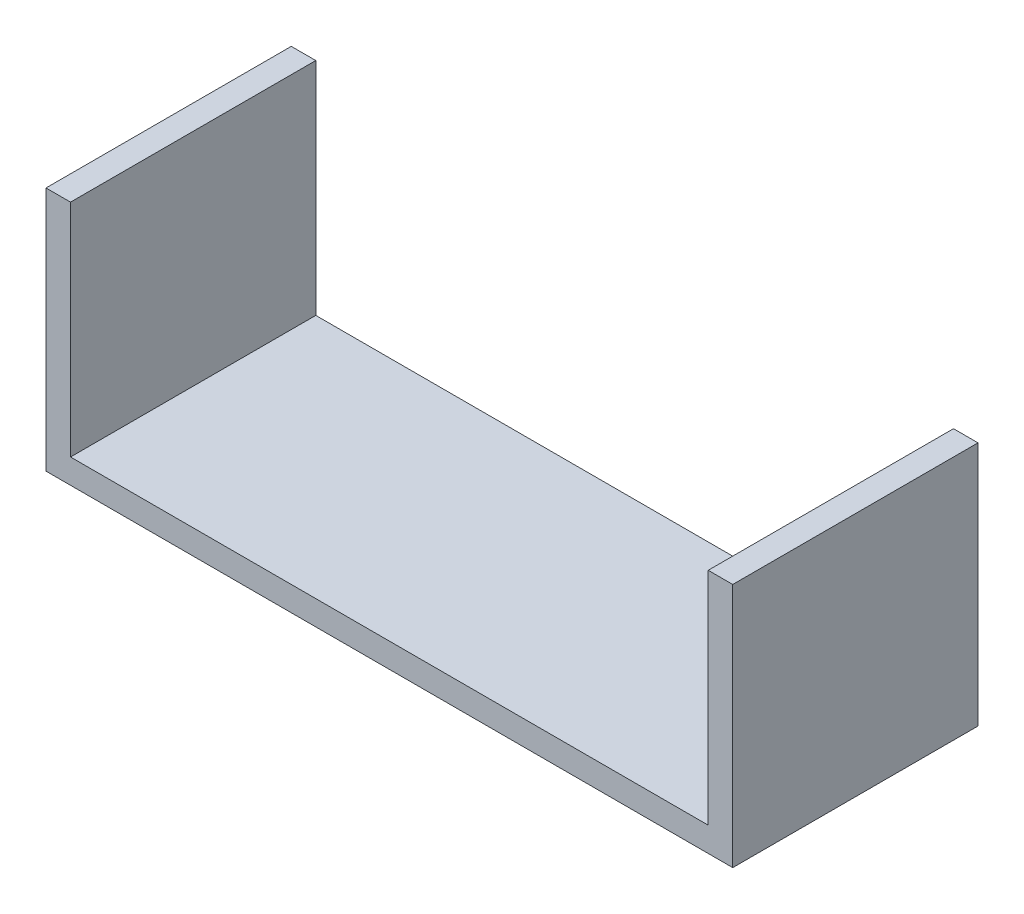
ISO-10303-21;
HEADER;
FILE_DESCRIPTION(('STEP AP214'),'2;1');
FILE_NAME('part.step','',(''),(''),'','','');
FILE_SCHEMA(('AUTOMOTIVE_DESIGN { 1 0 10303 214 1 1 1 1 }'));
ENDSEC;
DATA;
#1=APPLICATION_CONTEXT('core data for automotive mechanical design processes');
#2=APPLICATION_PROTOCOL_DEFINITION('international standard','automotive_design',2000,#1);
#3=PRODUCT_CONTEXT('',#1,'mechanical');
#4=PRODUCT('Part','Part','',(#3));
#5=PRODUCT_RELATED_PRODUCT_CATEGORY('part','',(#4));
#6=PRODUCT_DEFINITION_FORMATION('','',#4);
#7=PRODUCT_DEFINITION_CONTEXT('part definition',#1,'design');
#8=PRODUCT_DEFINITION('design','',#6,#7);
#9=PRODUCT_DEFINITION_SHAPE('','',#8);
#10=(LENGTH_UNIT() NAMED_UNIT(*) SI_UNIT(.MILLI.,.METRE.));
#11=(NAMED_UNIT(*) PLANE_ANGLE_UNIT() SI_UNIT($,.RADIAN.));
#12=(NAMED_UNIT(*) SI_UNIT($,.STERADIAN.) SOLID_ANGLE_UNIT());
#13=UNCERTAINTY_MEASURE_WITH_UNIT(LENGTH_MEASURE(1.E-05),#10,'distance_accuracy_value','');
#14=(GEOMETRIC_REPRESENTATION_CONTEXT(3) GLOBAL_UNCERTAINTY_ASSIGNED_CONTEXT((#13)) GLOBAL_UNIT_ASSIGNED_CONTEXT((#10,
#11,#12)) REPRESENTATION_CONTEXT('',''));
#15=CARTESIAN_POINT('',(0.,0.,0.));
#16=DIRECTION('',(0.,0.,1.));
#17=DIRECTION('',(1.,0.,0.));
#18=AXIS2_PLACEMENT_3D('',#15,#16,#17);
#19=CARTESIAN_POINT('',(0.,50.,50.));
#20=DIRECTION('',(0.,1.,0.));
#21=DIRECTION('',(0.,0.,1.));
#22=AXIS2_PLACEMENT_3D('',#19,#20,#21);
#23=PLANE('',#22);
#24=DIRECTION('',(1.,0.,0.));
#25=VECTOR('',#24,1.);
#26=CARTESIAN_POINT('',(0.,50.,0.));
#27=LINE('',#26,#25);
#28=CARTESIAN_POINT('',(135.,50.,0.));
#29=VERTEX_POINT('',#28);
#30=CARTESIAN_POINT('',(140.,50.,0.));
#31=VERTEX_POINT('',#30);
#32=EDGE_CURVE('E145',#29,#31,#27,.T.);
#33=ORIENTED_EDGE('',*,*,#32,.F.);
#34=DIRECTION('',(0.,0.,-1.));
#35=VECTOR('',#34,1.);
#36=CARTESIAN_POINT('',(135.,50.,50.));
#37=LINE('',#36,#35);
#38=CARTESIAN_POINT('',(135.,50.,50.));
#39=VERTEX_POINT('',#38);
#40=EDGE_CURVE('E11',#39,#29,#37,.T.);
#41=ORIENTED_EDGE('',*,*,#40,.F.);
#42=DIRECTION('',(1.,0.,0.));
#43=VECTOR('',#42,1.);
#44=CARTESIAN_POINT('',(0.,50.,50.));
#45=LINE('',#44,#43);
#46=CARTESIAN_POINT('',(140.,50.,50.));
#47=VERTEX_POINT('',#46);
#48=EDGE_CURVE('E139',#39,#47,#45,.T.);
#49=ORIENTED_EDGE('',*,*,#48,.T.);
#50=DIRECTION('',(0.,0.,-1.));
#51=VECTOR('',#50,1.);
#52=CARTESIAN_POINT('',(140.,50.,50.));
#53=LINE('',#52,#51);
#54=EDGE_CURVE('E93',#47,#31,#53,.T.);
#55=ORIENTED_EDGE('',*,*,#54,.T.);
#56=EDGE_LOOP('',(#33,#41,#49,#55));
#57=FACE_BOUND('',#56,.T.);
#58=ADVANCED_FACE('F41',(#57),#23,.T.);
#59=CARTESIAN_POINT('',(135.,0.,50.));
#60=DIRECTION('',(1.,0.,0.));
#61=DIRECTION('',(0.,0.,-1.));
#62=AXIS2_PLACEMENT_3D('',#59,#60,#61);
#63=PLANE('',#62);
#64=DIRECTION('',(0.,-1.,0.));
#65=VECTOR('',#64,1.);
#66=CARTESIAN_POINT('',(135.,0.,0.));
#67=LINE('',#66,#65);
#68=CARTESIAN_POINT('',(135.,5.,0.));
#69=VERTEX_POINT('',#68);
#70=EDGE_CURVE('E149',#29,#69,#67,.T.);
#71=ORIENTED_EDGE('',*,*,#70,.T.);
#72=DIRECTION('',(0.,0.,-1.));
#73=VECTOR('',#72,1.);
#74=CARTESIAN_POINT('',(135.,5.,50.));
#75=LINE('',#74,#73);
#76=CARTESIAN_POINT('',(135.,5.,50.));
#77=VERTEX_POINT('',#76);
#78=EDGE_CURVE('E51',#77,#69,#75,.T.);
#79=ORIENTED_EDGE('',*,*,#78,.F.);
#80=DIRECTION('',(0.,-1.,0.));
#81=VECTOR('',#80,1.);
#82=CARTESIAN_POINT('',(135.,0.,50.));
#83=LINE('',#82,#81);
#84=EDGE_CURVE('E198',#39,#77,#83,.T.);
#85=ORIENTED_EDGE('',*,*,#84,.F.);
#86=ORIENTED_EDGE('',*,*,#40,.T.);
#87=EDGE_LOOP('',(#71,#79,#85,#86));
#88=FACE_BOUND('',#87,.T.);
#89=ADVANCED_FACE('F43',(#88),#63,.F.);
#90=CARTESIAN_POINT('',(0.,5.,50.));
#91=DIRECTION('',(0.,1.,0.));
#92=DIRECTION('',(0.,0.,1.));
#93=AXIS2_PLACEMENT_3D('',#90,#91,#92);
#94=PLANE('',#93);
#95=DIRECTION('',(1.,0.,0.));
#96=VECTOR('',#95,1.);
#97=CARTESIAN_POINT('',(0.,5.,0.));
#98=LINE('',#97,#96);
#99=CARTESIAN_POINT('',(5.,5.,0.));
#100=VERTEX_POINT('',#99);
#101=EDGE_CURVE('E154',#100,#69,#98,.T.);
#102=ORIENTED_EDGE('',*,*,#101,.F.);
#103=DIRECTION('',(0.,0.,-1.));
#104=VECTOR('',#103,1.);
#105=CARTESIAN_POINT('',(5.,5.,50.));
#106=LINE('',#105,#104);
#107=CARTESIAN_POINT('',(5.,5.,50.));
#108=VERTEX_POINT('',#107);
#109=EDGE_CURVE('E178',#108,#100,#106,.T.);
#110=ORIENTED_EDGE('',*,*,#109,.F.);
#111=DIRECTION('',(1.,0.,0.));
#112=VECTOR('',#111,1.);
#113=CARTESIAN_POINT('',(0.,5.,50.));
#114=LINE('',#113,#112);
#115=EDGE_CURVE('E187',#108,#77,#114,.T.);
#116=ORIENTED_EDGE('',*,*,#115,.T.);
#117=ORIENTED_EDGE('',*,*,#78,.T.);
#118=EDGE_LOOP('',(#102,#110,#116,#117));
#119=FACE_BOUND('',#118,.T.);
#120=ADVANCED_FACE('F185',(#119),#94,.T.);
#121=CARTESIAN_POINT('',(5.00000000000001,0.,50.));
#122=DIRECTION('',(1.,0.,0.));
#123=DIRECTION('',(0.,1.,0.));
#124=AXIS2_PLACEMENT_3D('',#121,#122,#123);
#125=PLANE('',#124);
#126=DIRECTION('',(0.,-1.,0.));
#127=VECTOR('',#126,1.);
#128=CARTESIAN_POINT('',(5.00000000000001,0.,0.));
#129=LINE('',#128,#127);
#130=CARTESIAN_POINT('',(5.,50.,0.));
#131=VERTEX_POINT('',#130);
#132=EDGE_CURVE('E158',#131,#100,#129,.T.);
#133=ORIENTED_EDGE('',*,*,#132,.F.);
#134=DIRECTION('',(0.,0.,-1.));
#135=VECTOR('',#134,1.);
#136=CARTESIAN_POINT('',(5.,50.,50.));
#137=LINE('',#136,#135);
#138=CARTESIAN_POINT('',(5.,50.,50.));
#139=VERTEX_POINT('',#138);
#140=EDGE_CURVE('E175',#139,#131,#137,.T.);
#141=ORIENTED_EDGE('',*,*,#140,.F.);
#142=DIRECTION('',(0.,-1.,0.));
#143=VECTOR('',#142,1.);
#144=CARTESIAN_POINT('',(5.00000000000001,0.,50.));
#145=LINE('',#144,#143);
#146=EDGE_CURVE('E137',#139,#108,#145,.T.);
#147=ORIENTED_EDGE('',*,*,#146,.T.);
#148=ORIENTED_EDGE('',*,*,#109,.T.);
#149=EDGE_LOOP('',(#133,#141,#147,#148));
#150=FACE_BOUND('',#149,.T.);
#151=ADVANCED_FACE('F196',(#150),#125,.T.);
#152=CARTESIAN_POINT('',(0.,50.,0.));
#153=VERTEX_POINT('',#152);
#154=EDGE_CURVE('E150',#153,#131,#27,.T.);
#155=ORIENTED_EDGE('',*,*,#154,.F.);
#156=DIRECTION('',(0.,0.,-1.));
#157=VECTOR('',#156,1.);
#158=CARTESIAN_POINT('',(0.,50.,50.));
#159=LINE('',#158,#157);
#160=CARTESIAN_POINT('',(0.,50.,50.));
#161=VERTEX_POINT('',#160);
#162=EDGE_CURVE('E122',#161,#153,#159,.T.);
#163=ORIENTED_EDGE('',*,*,#162,.F.);
#164=EDGE_CURVE('E133',#161,#139,#45,.T.);
#165=ORIENTED_EDGE('',*,*,#164,.T.);
#166=ORIENTED_EDGE('',*,*,#140,.T.);
#167=EDGE_LOOP('',(#155,#163,#165,#166));
#168=FACE_BOUND('',#167,.T.);
#169=ADVANCED_FACE('F206',(#168),#23,.T.);
#170=CARTESIAN_POINT('',(0.,0.,50.));
#171=DIRECTION('',(-1.,0.,0.));
#172=DIRECTION('',(0.,0.,1.));
#173=AXIS2_PLACEMENT_3D('',#170,#171,#172);
#174=PLANE('',#173);
#175=DIRECTION('',(0.,1.,0.));
#176=VECTOR('',#175,1.);
#177=CARTESIAN_POINT('',(0.,0.,0.));
#178=LINE('',#177,#176);
#179=CARTESIAN_POINT('',(0.,0.,0.));
#180=VERTEX_POINT('',#179);
#181=EDGE_CURVE('E120',#180,#153,#178,.T.);
#182=ORIENTED_EDGE('',*,*,#181,.F.);
#183=DIRECTION('',(0.,0.,-1.));
#184=VECTOR('',#183,1.);
#185=CARTESIAN_POINT('',(0.,0.,50.));
#186=LINE('',#185,#184);
#187=CARTESIAN_POINT('',(0.,0.,50.));
#188=VERTEX_POINT('',#187);
#189=EDGE_CURVE('E114',#188,#180,#186,.T.);
#190=ORIENTED_EDGE('',*,*,#189,.F.);
#191=DIRECTION('',(0.,1.,0.));
#192=VECTOR('',#191,1.);
#193=CARTESIAN_POINT('',(0.,0.,50.));
#194=LINE('',#193,#192);
#195=EDGE_CURVE('E118',#188,#161,#194,.T.);
#196=ORIENTED_EDGE('',*,*,#195,.T.);
#197=ORIENTED_EDGE('',*,*,#162,.T.);
#198=EDGE_LOOP('',(#182,#190,#196,#197));
#199=FACE_BOUND('',#198,.T.);
#200=ADVANCED_FACE('F116',(#199),#174,.T.);
#201=CARTESIAN_POINT('',(0.,0.,50.));
#202=DIRECTION('',(0.,1.,0.));
#203=DIRECTION('',(0.,0.,1.));
#204=AXIS2_PLACEMENT_3D('',#201,#202,#203);
#205=PLANE('',#204);
#206=DIRECTION('',(1.,0.,0.));
#207=VECTOR('',#206,1.);
#208=CARTESIAN_POINT('',(0.,0.,0.));
#209=LINE('',#208,#207);
#210=CARTESIAN_POINT('',(140.,0.,0.));
#211=VERTEX_POINT('',#210);
#212=EDGE_CURVE('E86',#180,#211,#209,.T.);
#213=ORIENTED_EDGE('',*,*,#212,.T.);
#214=DIRECTION('',(0.,0.,-1.));
#215=VECTOR('',#214,1.);
#216=CARTESIAN_POINT('',(140.,0.,50.));
#217=LINE('',#216,#215);
#218=CARTESIAN_POINT('',(140.,0.,50.));
#219=VERTEX_POINT('',#218);
#220=EDGE_CURVE('E123',#219,#211,#217,.T.);
#221=ORIENTED_EDGE('',*,*,#220,.F.);
#222=DIRECTION('',(1.,0.,0.));
#223=VECTOR('',#222,1.);
#224=CARTESIAN_POINT('',(0.,0.,50.));
#225=LINE('',#224,#223);
#226=EDGE_CURVE('E125',#188,#219,#225,.T.);
#227=ORIENTED_EDGE('',*,*,#226,.F.);
#228=ORIENTED_EDGE('',*,*,#189,.T.);
#229=EDGE_LOOP('',(#213,#221,#227,#228));
#230=FACE_BOUND('',#229,.T.);
#231=ADVANCED_FACE('F126',(#230),#205,.F.);
#232=CARTESIAN_POINT('',(140.,0.,50.));
#233=DIRECTION('',(-1.,0.,0.));
#234=DIRECTION('',(0.,0.,1.));
#235=AXIS2_PLACEMENT_3D('',#232,#233,#234);
#236=PLANE('',#235);
#237=DIRECTION('',(0.,1.,0.));
#238=VECTOR('',#237,1.);
#239=CARTESIAN_POINT('',(140.,0.,0.));
#240=LINE('',#239,#238);
#241=EDGE_CURVE('E166',#211,#31,#240,.T.);
#242=ORIENTED_EDGE('',*,*,#241,.T.);
#243=ORIENTED_EDGE('',*,*,#54,.F.);
#244=DIRECTION('',(0.,1.,0.));
#245=VECTOR('',#244,1.);
#246=CARTESIAN_POINT('',(140.,0.,50.));
#247=LINE('',#246,#245);
#248=EDGE_CURVE('E59',#219,#47,#247,.T.);
#249=ORIENTED_EDGE('',*,*,#248,.F.);
#250=ORIENTED_EDGE('',*,*,#220,.T.);
#251=EDGE_LOOP('',(#242,#243,#249,#250));
#252=FACE_BOUND('',#251,.T.);
#253=ADVANCED_FACE('F221',(#252),#236,.F.);
#254=CARTESIAN_POINT('',(0.,0.,50.));
#255=DIRECTION('',(0.,0.,1.));
#256=DIRECTION('',(1.,0.,0.));
#257=AXIS2_PLACEMENT_3D('',#254,#255,#256);
#258=PLANE('',#257);
#259=ORIENTED_EDGE('',*,*,#48,.F.);
#260=ORIENTED_EDGE('',*,*,#84,.T.);
#261=ORIENTED_EDGE('',*,*,#115,.F.);
#262=ORIENTED_EDGE('',*,*,#146,.F.);
#263=ORIENTED_EDGE('',*,*,#164,.F.);
#264=ORIENTED_EDGE('',*,*,#195,.F.);
#265=ORIENTED_EDGE('',*,*,#226,.T.);
#266=ORIENTED_EDGE('',*,*,#248,.T.);
#267=EDGE_LOOP('',(#259,#260,#261,#262,#263,#264,#265,#266));
#268=FACE_BOUND('',#267,.T.);
#269=ADVANCED_FACE('F130',(#268),#258,.T.);
#270=CARTESIAN_POINT('',(0.,0.,0.));
#271=DIRECTION('',(0.,0.,1.));
#272=DIRECTION('',(1.,0.,0.));
#273=AXIS2_PLACEMENT_3D('',#270,#271,#272);
#274=PLANE('',#273);
#275=ORIENTED_EDGE('',*,*,#32,.T.);
#276=ORIENTED_EDGE('',*,*,#241,.F.);
#277=ORIENTED_EDGE('',*,*,#212,.F.);
#278=ORIENTED_EDGE('',*,*,#181,.T.);
#279=ORIENTED_EDGE('',*,*,#154,.T.);
#280=ORIENTED_EDGE('',*,*,#132,.T.);
#281=ORIENTED_EDGE('',*,*,#101,.T.);
#282=ORIENTED_EDGE('',*,*,#70,.F.);
#283=EDGE_LOOP('',(#275,#276,#277,#278,#279,#280,#281,#282));
#284=FACE_BOUND('',#283,.T.);
#285=ADVANCED_FACE('F191',(#284),#274,.F.);
#286=CLOSED_SHELL('',(#58,#89,#120,#151,#169,#200,#231,#253,#269,#285));
#287=MANIFOLD_SOLID_BREP('B2',#286);
#288=ADVANCED_BREP_SHAPE_REPRESENTATION('',(#18,#287),#14);
#289=SHAPE_DEFINITION_REPRESENTATION(#9,#288);
ENDSEC;
END-ISO-10303-21;
